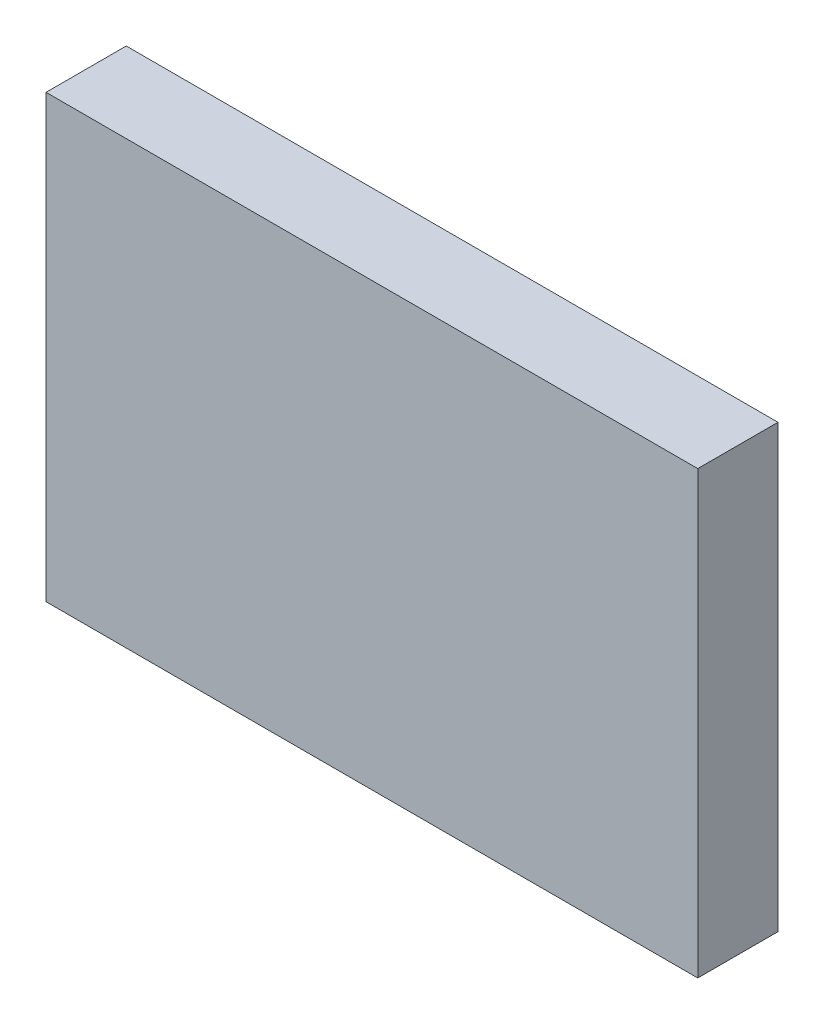
ISO-10303-21;
HEADER;
FILE_DESCRIPTION(('STEP AP214'),'2;1');
FILE_NAME('part.step','',(''),(''),'','','');
FILE_SCHEMA(('AUTOMOTIVE_DESIGN { 1 0 10303 214 1 1 1 1 }'));
ENDSEC;
DATA;
#1=APPLICATION_CONTEXT('core data for automotive mechanical design processes');
#2=APPLICATION_PROTOCOL_DEFINITION('international standard','automotive_design',2000,#1);
#3=PRODUCT_CONTEXT('',#1,'mechanical');
#4=PRODUCT('Part','Part','',(#3));
#5=PRODUCT_RELATED_PRODUCT_CATEGORY('part','',(#4));
#6=PRODUCT_DEFINITION_FORMATION('','',#4);
#7=PRODUCT_DEFINITION_CONTEXT('part definition',#1,'design');
#8=PRODUCT_DEFINITION('design','',#6,#7);
#9=PRODUCT_DEFINITION_SHAPE('','',#8);
#10=(LENGTH_UNIT() NAMED_UNIT(*) SI_UNIT(.MILLI.,.METRE.));
#11=(NAMED_UNIT(*) PLANE_ANGLE_UNIT() SI_UNIT($,.RADIAN.));
#12=(NAMED_UNIT(*) SI_UNIT($,.STERADIAN.) SOLID_ANGLE_UNIT());
#13=UNCERTAINTY_MEASURE_WITH_UNIT(LENGTH_MEASURE(1.E-05),#10,'distance_accuracy_value','');
#14=(GEOMETRIC_REPRESENTATION_CONTEXT(3) GLOBAL_UNCERTAINTY_ASSIGNED_CONTEXT((#13)) GLOBAL_UNIT_ASSIGNED_CONTEXT((#10,
#11,#12)) REPRESENTATION_CONTEXT('',''));
#15=CARTESIAN_POINT('',(0.,0.,0.));
#16=DIRECTION('',(0.,0.,1.));
#17=DIRECTION('',(1.,0.,0.));
#18=AXIS2_PLACEMENT_3D('',#15,#16,#17);
#19=CARTESIAN_POINT('',(0.,0.,8.));
#20=DIRECTION('',(1.,0.,0.));
#21=DIRECTION('',(0.,0.,-1.));
#22=AXIS2_PLACEMENT_3D('',#19,#20,#21);
#23=PLANE('',#22);
#24=DIRECTION('',(0.,-1.,0.));
#25=VECTOR('',#24,1.);
#26=CARTESIAN_POINT('',(0.,0.,0.));
#27=LINE('',#26,#25);
#28=CARTESIAN_POINT('',(0.,44.,0.));
#29=VERTEX_POINT('',#28);
#30=CARTESIAN_POINT('',(0.,0.,0.));
#31=VERTEX_POINT('',#30);
#32=EDGE_CURVE('E99',#29,#31,#27,.T.);
#33=ORIENTED_EDGE('',*,*,#32,.T.);
#34=DIRECTION('',(0.,0.,-1.));
#35=VECTOR('',#34,1.);
#36=CARTESIAN_POINT('',(0.,0.,8.));
#37=LINE('',#36,#35);
#38=CARTESIAN_POINT('',(0.,0.,8.));
#39=VERTEX_POINT('',#38);
#40=EDGE_CURVE('E11',#39,#31,#37,.T.);
#41=ORIENTED_EDGE('',*,*,#40,.F.);
#42=DIRECTION('',(0.,-1.,0.));
#43=VECTOR('',#42,1.);
#44=CARTESIAN_POINT('',(0.,0.,8.));
#45=LINE('',#44,#43);
#46=CARTESIAN_POINT('',(0.,44.,8.));
#47=VERTEX_POINT('',#46);
#48=EDGE_CURVE('E87',#47,#39,#45,.T.);
#49=ORIENTED_EDGE('',*,*,#48,.F.);
#50=DIRECTION('',(0.,0.,-1.));
#51=VECTOR('',#50,1.);
#52=CARTESIAN_POINT('',(0.,44.,8.));
#53=LINE('',#52,#51);
#54=EDGE_CURVE('E95',#47,#29,#53,.T.);
#55=ORIENTED_EDGE('',*,*,#54,.T.);
#56=EDGE_LOOP('',(#33,#41,#49,#55));
#57=FACE_BOUND('',#56,.T.);
#58=ADVANCED_FACE('F36',(#57),#23,.F.);
#59=CARTESIAN_POINT('',(0.,0.,8.));
#60=DIRECTION('',(0.,1.,0.));
#61=DIRECTION('',(0.,0.,1.));
#62=AXIS2_PLACEMENT_3D('',#59,#60,#61);
#63=PLANE('',#62);
#64=DIRECTION('',(1.,0.,0.));
#65=VECTOR('',#64,1.);
#66=CARTESIAN_POINT('',(0.,0.,0.));
#67=LINE('',#66,#65);
#68=CARTESIAN_POINT('',(65.,0.,0.));
#69=VERTEX_POINT('',#68);
#70=EDGE_CURVE('E91',#31,#69,#67,.T.);
#71=ORIENTED_EDGE('',*,*,#70,.T.);
#72=DIRECTION('',(0.,0.,-1.));
#73=VECTOR('',#72,1.);
#74=CARTESIAN_POINT('',(65.,0.,8.));
#75=LINE('',#74,#73);
#76=CARTESIAN_POINT('',(65.,0.,8.));
#77=VERTEX_POINT('',#76);
#78=EDGE_CURVE('E44',#77,#69,#75,.T.);
#79=ORIENTED_EDGE('',*,*,#78,.F.);
#80=DIRECTION('',(1.,0.,0.));
#81=VECTOR('',#80,1.);
#82=CARTESIAN_POINT('',(0.,0.,8.));
#83=LINE('',#82,#81);
#84=EDGE_CURVE('E82',#39,#77,#83,.T.);
#85=ORIENTED_EDGE('',*,*,#84,.F.);
#86=ORIENTED_EDGE('',*,*,#40,.T.);
#87=EDGE_LOOP('',(#71,#79,#85,#86));
#88=FACE_BOUND('',#87,.T.);
#89=ADVANCED_FACE('F90',(#88),#63,.F.);
#90=CARTESIAN_POINT('',(65.,0.,8.));
#91=DIRECTION('',(-1.,0.,0.));
#92=DIRECTION('',(0.,0.,1.));
#93=AXIS2_PLACEMENT_3D('',#90,#91,#92);
#94=PLANE('',#93);
#95=DIRECTION('',(0.,1.,0.));
#96=VECTOR('',#95,1.);
#97=CARTESIAN_POINT('',(65.,0.,0.));
#98=LINE('',#97,#96);
#99=CARTESIAN_POINT('',(65.,44.,0.));
#100=VERTEX_POINT('',#99);
#101=EDGE_CURVE('E69',#69,#100,#98,.T.);
#102=ORIENTED_EDGE('',*,*,#101,.T.);
#103=DIRECTION('',(0.,0.,-1.));
#104=VECTOR('',#103,1.);
#105=CARTESIAN_POINT('',(65.,44.,8.));
#106=LINE('',#105,#104);
#107=CARTESIAN_POINT('',(65.,44.,8.));
#108=VERTEX_POINT('',#107);
#109=EDGE_CURVE('E92',#108,#100,#106,.T.);
#110=ORIENTED_EDGE('',*,*,#109,.F.);
#111=DIRECTION('',(0.,1.,0.));
#112=VECTOR('',#111,1.);
#113=CARTESIAN_POINT('',(65.,0.,8.));
#114=LINE('',#113,#112);
#115=EDGE_CURVE('E85',#77,#108,#114,.T.);
#116=ORIENTED_EDGE('',*,*,#115,.F.);
#117=ORIENTED_EDGE('',*,*,#78,.T.);
#118=EDGE_LOOP('',(#102,#110,#116,#117));
#119=FACE_BOUND('',#118,.T.);
#120=ADVANCED_FACE('F93',(#119),#94,.F.);
#121=CARTESIAN_POINT('',(0.,44.,8.));
#122=DIRECTION('',(0.,-1.,0.));
#123=DIRECTION('',(0.,0.,-1.));
#124=AXIS2_PLACEMENT_3D('',#121,#122,#123);
#125=PLANE('',#124);
#126=DIRECTION('',(-1.,0.,0.));
#127=VECTOR('',#126,1.);
#128=CARTESIAN_POINT('',(0.,44.,0.));
#129=LINE('',#128,#127);
#130=EDGE_CURVE('E75',#100,#29,#129,.T.);
#131=ORIENTED_EDGE('',*,*,#130,.T.);
#132=ORIENTED_EDGE('',*,*,#54,.F.);
#133=DIRECTION('',(-1.,0.,0.));
#134=VECTOR('',#133,1.);
#135=CARTESIAN_POINT('',(0.,44.,8.));
#136=LINE('',#135,#134);
#137=EDGE_CURVE('E52',#108,#47,#136,.T.);
#138=ORIENTED_EDGE('',*,*,#137,.F.);
#139=ORIENTED_EDGE('',*,*,#109,.T.);
#140=EDGE_LOOP('',(#131,#132,#138,#139));
#141=FACE_BOUND('',#140,.T.);
#142=ADVANCED_FACE('F106',(#141),#125,.F.);
#143=CARTESIAN_POINT('',(0.,0.,8.));
#144=DIRECTION('',(0.,0.,-1.));
#145=DIRECTION('',(-1.,0.,0.));
#146=AXIS2_PLACEMENT_3D('',#143,#144,#145);
#147=PLANE('',#146);
#148=ORIENTED_EDGE('',*,*,#48,.T.);
#149=ORIENTED_EDGE('',*,*,#84,.T.);
#150=ORIENTED_EDGE('',*,*,#115,.T.);
#151=ORIENTED_EDGE('',*,*,#137,.T.);
#152=EDGE_LOOP('',(#148,#149,#150,#151));
#153=FACE_BOUND('',#152,.T.);
#154=ADVANCED_FACE('F83',(#153),#147,.F.);
#155=CARTESIAN_POINT('',(0.,0.,0.));
#156=DIRECTION('',(0.,0.,-1.));
#157=DIRECTION('',(-1.,0.,0.));
#158=AXIS2_PLACEMENT_3D('',#155,#156,#157);
#159=PLANE('',#158);
#160=ORIENTED_EDGE('',*,*,#32,.F.);
#161=ORIENTED_EDGE('',*,*,#130,.F.);
#162=ORIENTED_EDGE('',*,*,#101,.F.);
#163=ORIENTED_EDGE('',*,*,#70,.F.);
#164=EDGE_LOOP('',(#160,#161,#162,#163));
#165=FACE_BOUND('',#164,.T.);
#166=ADVANCED_FACE('F109',(#165),#159,.T.);
#167=CLOSED_SHELL('',(#58,#89,#120,#142,#154,#166));
#168=MANIFOLD_SOLID_BREP('B2',#167);
#169=ADVANCED_BREP_SHAPE_REPRESENTATION('',(#18,#168),#14);
#170=SHAPE_DEFINITION_REPRESENTATION(#9,#169);
ENDSEC;
END-ISO-10303-21;
